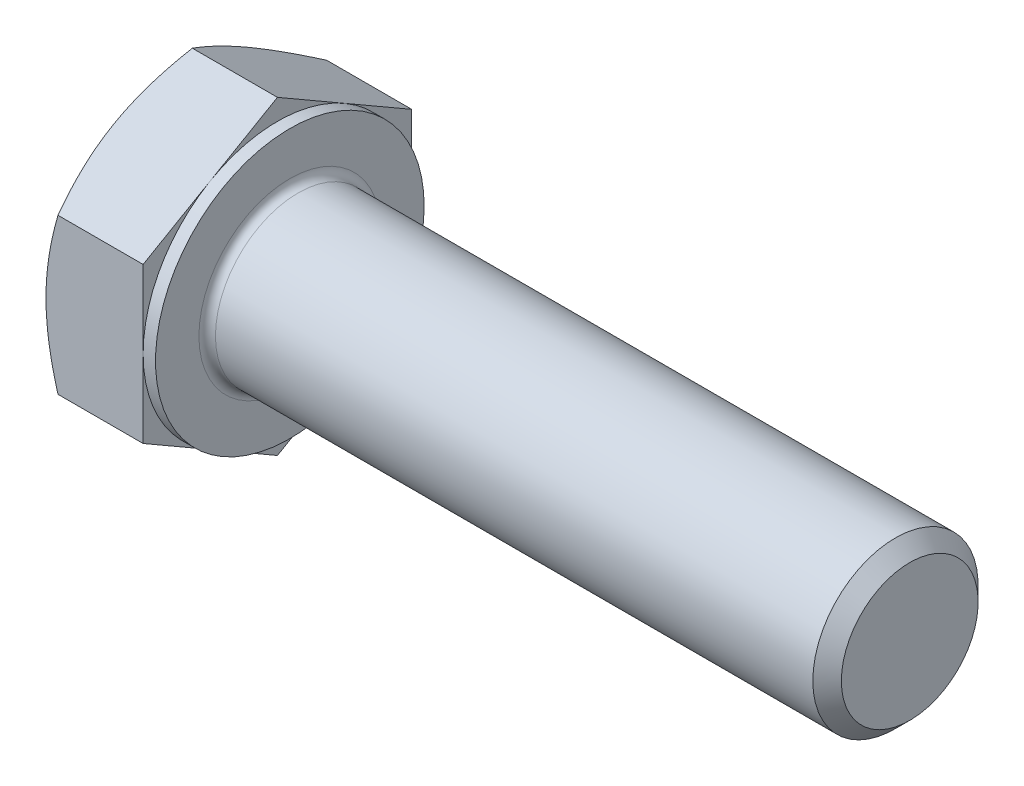
ISO-10303-21;
HEADER;
FILE_DESCRIPTION(('STEP AP214'),'2;1');
FILE_NAME('part.step','',(''),(''),'','','');
FILE_SCHEMA(('AUTOMOTIVE_DESIGN { 1 0 10303 214 1 1 1 1 }'));
ENDSEC;
DATA;
#1=APPLICATION_CONTEXT('core data for automotive mechanical design processes');
#2=APPLICATION_PROTOCOL_DEFINITION('international standard','automotive_design',2000,#1);
#3=PRODUCT_CONTEXT('',#1,'mechanical');
#4=PRODUCT('Part','Part','',(#3));
#5=PRODUCT_RELATED_PRODUCT_CATEGORY('part','',(#4));
#6=PRODUCT_DEFINITION_FORMATION('','',#4);
#7=PRODUCT_DEFINITION_CONTEXT('part definition',#1,'design');
#8=PRODUCT_DEFINITION('design','',#6,#7);
#9=PRODUCT_DEFINITION_SHAPE('','',#8);
#10=(LENGTH_UNIT() NAMED_UNIT(*) SI_UNIT(.MILLI.,.METRE.));
#11=(NAMED_UNIT(*) PLANE_ANGLE_UNIT() SI_UNIT($,.RADIAN.));
#12=(NAMED_UNIT(*) SI_UNIT($,.STERADIAN.) SOLID_ANGLE_UNIT());
#13=UNCERTAINTY_MEASURE_WITH_UNIT(LENGTH_MEASURE(1.E-05),#10,'distance_accuracy_value','');
#14=(GEOMETRIC_REPRESENTATION_CONTEXT(3) GLOBAL_UNCERTAINTY_ASSIGNED_CONTEXT((#13)) GLOBAL_UNIT_ASSIGNED_CONTEXT((#10,
#11,#12)) REPRESENTATION_CONTEXT('',''));
#15=CARTESIAN_POINT('',(0.,0.,0.));
#16=DIRECTION('',(0.,0.,1.));
#17=DIRECTION('',(1.,0.,0.));
#18=AXIS2_PLACEMENT_3D('',#15,#16,#17);
#19=CARTESIAN_POINT('',(5.3,7.50555349946514,0.));
#20=DIRECTION('',(1.,0.,0.));
#21=DIRECTION('',(0.,0.,-1.));
#22=AXIS2_PLACEMENT_3D('',#19,#20,#21);
#23=PLANE('',#22);
#24=CARTESIAN_POINT('',(5.3,0.,0.));
#25=DIRECTION('',(1.,0.,0.));
#26=DIRECTION('',(0.,0.,-1.));
#27=AXIS2_PLACEMENT_3D('',#24,#25,#26);
#28=CIRCLE('',#27,4.4);
#29=CARTESIAN_POINT('',(5.3,0.,-4.4));
#30=VERTEX_POINT('',#29);
#31=EDGE_CURVE('E45',#30,#30,#28,.F.);
#32=ORIENTED_EDGE('',*,*,#31,.T.);
#33=EDGE_LOOP('',(#32));
#34=FACE_BOUND('',#33,.T.);
#35=CARTESIAN_POINT('',(5.3,0.,0.));
#36=DIRECTION('',(1.,0.,0.));
#37=DIRECTION('',(0.,0.,-1.));
#38=AXIS2_PLACEMENT_3D('',#35,#36,#37);
#39=CIRCLE('',#38,6.5);
#40=CARTESIAN_POINT('',(5.3,0.,-6.5));
#41=VERTEX_POINT('',#40);
#42=EDGE_CURVE('E296',#41,#41,#39,.T.);
#43=ORIENTED_EDGE('',*,*,#42,.T.);
#44=EDGE_LOOP('',(#43));
#45=FACE_BOUND('',#44,.T.);
#46=ADVANCED_FACE('F37',(#34,#45),#23,.T.);
#47=CARTESIAN_POINT('',(0.,0.,0.));
#48=DIRECTION('',(-1.,0.,0.));
#49=DIRECTION('',(0.,0.,1.));
#50=AXIS2_PLACEMENT_3D('',#47,#48,#49);
#51=CYLINDRICAL_SURFACE('',#50,4.);
#52=CARTESIAN_POINT('',(5.7,0.,0.));
#53=DIRECTION('',(1.,0.,0.));
#54=DIRECTION('',(0.,0.,-1.));
#55=AXIS2_PLACEMENT_3D('',#52,#53,#54);
#56=CIRCLE('',#55,4.);
#57=CARTESIAN_POINT('',(5.7,0.,-4.));
#58=VERTEX_POINT('',#57);
#59=EDGE_CURVE('E11',#58,#58,#56,.T.);
#60=ORIENTED_EDGE('',*,*,#59,.T.);
#61=EDGE_LOOP('',(#60));
#62=FACE_BOUND('',#61,.T.);
#63=CARTESIAN_POINT('',(34.6095000000001,0.,0.));
#64=DIRECTION('',(-1.,0.,0.));
#65=DIRECTION('',(0.,0.,1.));
#66=AXIS2_PLACEMENT_3D('',#63,#64,#65);
#67=CIRCLE('',#66,4.);
#68=CARTESIAN_POINT('',(34.6095000000001,0.,4.));
#69=VERTEX_POINT('',#68);
#70=EDGE_CURVE('E275',#69,#69,#67,.T.);
#71=ORIENTED_EDGE('',*,*,#70,.T.);
#72=EDGE_LOOP('',(#71));
#73=FACE_BOUND('',#72,.T.);
#74=ADVANCED_FACE('F249',(#62,#73),#51,.T.);
#75=CARTESIAN_POINT('',(35.3,0.,0.));
#76=DIRECTION('',(-1.,0.,0.));
#77=DIRECTION('',(0.,0.,1.));
#78=AXIS2_PLACEMENT_3D('',#75,#76,#77);
#79=CONICAL_SURFACE('',#78,3.3095,0.785398163397499);
#80=ORIENTED_EDGE('',*,*,#70,.F.);
#81=EDGE_LOOP('',(#80));
#82=FACE_BOUND('',#81,.T.);
#83=CARTESIAN_POINT('',(35.3,0.,0.));
#84=DIRECTION('',(-1.,0.,0.));
#85=DIRECTION('',(0.,0.,1.));
#86=AXIS2_PLACEMENT_3D('',#83,#84,#85);
#87=CIRCLE('',#86,3.3095);
#88=CARTESIAN_POINT('',(35.3,0.,3.3095));
#89=VERTEX_POINT('',#88);
#90=EDGE_CURVE('E273',#89,#89,#87,.T.);
#91=ORIENTED_EDGE('',*,*,#90,.T.);
#92=EDGE_LOOP('',(#91));
#93=FACE_BOUND('',#92,.T.);
#94=ADVANCED_FACE('F254',(#82,#93),#79,.T.);
#95=CARTESIAN_POINT('',(35.3,0.,0.));
#96=DIRECTION('',(-1.,0.,0.));
#97=DIRECTION('',(0.,0.,1.));
#98=AXIS2_PLACEMENT_3D('',#95,#96,#97);
#99=PLANE('',#98);
#100=ORIENTED_EDGE('',*,*,#90,.F.);
#101=EDGE_LOOP('',(#100));
#102=FACE_BOUND('',#101,.T.);
#103=ADVANCED_FACE('F261',(#102),#99,.F.);
#104=CARTESIAN_POINT('',(4.7,6.5,0.));
#105=DIRECTION('',(1.,0.,0.));
#106=DIRECTION('',(0.,0.,-1.));
#107=AXIS2_PLACEMENT_3D('',#104,#105,#106);
#108=PLANE('',#107);
#109=DIRECTION('',(0.,0.500000000000001,0.866025403784438));
#110=VECTOR('',#109,1.);
#111=CARTESIAN_POINT('',(4.7,3.75277674973256,-6.5));
#112=LINE('',#111,#110);
#113=CARTESIAN_POINT('',(4.7,3.75277674973256,-6.5));
#114=VERTEX_POINT('',#113);
#115=CARTESIAN_POINT('',(4.7,5.62916512459885,-3.25));
#116=VERTEX_POINT('',#115);
#117=EDGE_CURVE('E169',#114,#116,#112,.T.);
#118=ORIENTED_EDGE('',*,*,#117,.T.);
#119=CARTESIAN_POINT('',(4.7,0.,0.));
#120=DIRECTION('',(-1.,0.,0.));
#121=DIRECTION('',(0.,0.,1.));
#122=AXIS2_PLACEMENT_3D('',#119,#120,#121);
#123=CIRCLE('',#122,6.5);
#124=CARTESIAN_POINT('',(4.7,0.,-6.5));
#125=VERTEX_POINT('',#124);
#126=EDGE_CURVE('E52',#116,#125,#123,.T.);
#127=ORIENTED_EDGE('',*,*,#126,.T.);
#128=DIRECTION('',(0.,1.,0.));
#129=VECTOR('',#128,1.);
#130=CARTESIAN_POINT('',(4.7,3.75277674973256,-6.5));
#131=LINE('',#130,#129);
#132=EDGE_CURVE('E299',#125,#114,#131,.T.);
#133=ORIENTED_EDGE('',*,*,#132,.T.);
#134=EDGE_LOOP('',(#118,#127,#133));
#135=FACE_BOUND('',#134,.T.);
#136=ADVANCED_FACE('F264',(#135),#108,.T.);
#137=CARTESIAN_POINT('',(4.7,7.50555349946514,0.));
#138=VERTEX_POINT('',#137);
#139=EDGE_CURVE('E167',#116,#138,#112,.T.);
#140=ORIENTED_EDGE('',*,*,#139,.T.);
#141=DIRECTION('',(0.,-0.500000000000001,0.866025403784438));
#142=VECTOR('',#141,1.);
#143=CARTESIAN_POINT('',(4.7,7.50555349946514,0.));
#144=LINE('',#143,#142);
#145=CARTESIAN_POINT('',(4.7,5.62916512459885,3.25));
#146=VERTEX_POINT('',#145);
#147=EDGE_CURVE('E166',#138,#146,#144,.T.);
#148=ORIENTED_EDGE('',*,*,#147,.T.);
#149=EDGE_CURVE('E155',#146,#116,#123,.T.);
#150=ORIENTED_EDGE('',*,*,#149,.T.);
#151=EDGE_LOOP('',(#140,#148,#150));
#152=FACE_BOUND('',#151,.T.);
#153=ADVANCED_FACE('F269',(#152),#108,.T.);
#154=CARTESIAN_POINT('',(4.7,3.75277674973257,6.5));
#155=VERTEX_POINT('',#154);
#156=EDGE_CURVE('E134',#146,#155,#144,.T.);
#157=ORIENTED_EDGE('',*,*,#156,.T.);
#158=DIRECTION('',(0.,-1.,0.));
#159=VECTOR('',#158,1.);
#160=CARTESIAN_POINT('',(4.7,3.75277674973257,6.5));
#161=LINE('',#160,#159);
#162=CARTESIAN_POINT('',(4.7,0.,6.5));
#163=VERTEX_POINT('',#162);
#164=EDGE_CURVE('E128',#155,#163,#161,.T.);
#165=ORIENTED_EDGE('',*,*,#164,.T.);
#166=EDGE_CURVE('E132',#163,#146,#123,.T.);
#167=ORIENTED_EDGE('',*,*,#166,.T.);
#168=EDGE_LOOP('',(#157,#165,#167));
#169=FACE_BOUND('',#168,.T.);
#170=ADVANCED_FACE('F130',(#169),#108,.T.);
#171=CARTESIAN_POINT('',(4.7,-3.75277674973257,6.5));
#172=VERTEX_POINT('',#171);
#173=EDGE_CURVE('E138',#163,#172,#161,.T.);
#174=ORIENTED_EDGE('',*,*,#173,.T.);
#175=DIRECTION('',(0.,-0.500000000000001,-0.866025403784438));
#176=VECTOR('',#175,1.);
#177=CARTESIAN_POINT('',(4.7,-7.50555349946515,0.));
#178=LINE('',#177,#176);
#179=CARTESIAN_POINT('',(4.7,-5.62916512459885,3.25000000000001));
#180=VERTEX_POINT('',#179);
#181=EDGE_CURVE('E145',#172,#180,#178,.T.);
#182=ORIENTED_EDGE('',*,*,#181,.T.);
#183=EDGE_CURVE('E142',#180,#163,#123,.T.);
#184=ORIENTED_EDGE('',*,*,#183,.T.);
#185=EDGE_LOOP('',(#174,#182,#184));
#186=FACE_BOUND('',#185,.T.);
#187=ADVANCED_FACE('F143',(#186),#108,.T.);
#188=CARTESIAN_POINT('',(4.7,-7.50555349946515,0.));
#189=VERTEX_POINT('',#188);
#190=EDGE_CURVE('E161',#180,#189,#178,.T.);
#191=ORIENTED_EDGE('',*,*,#190,.T.);
#192=DIRECTION('',(0.,0.5,-0.866025403784438));
#193=VECTOR('',#192,1.);
#194=CARTESIAN_POINT('',(4.7,-3.75277674973257,-6.5));
#195=LINE('',#194,#193);
#196=CARTESIAN_POINT('',(4.7,-5.62916512459885,-3.25));
#197=VERTEX_POINT('',#196);
#198=EDGE_CURVE('E337',#189,#197,#195,.T.);
#199=ORIENTED_EDGE('',*,*,#198,.T.);
#200=EDGE_CURVE('E149',#197,#180,#123,.T.);
#201=ORIENTED_EDGE('',*,*,#200,.T.);
#202=EDGE_LOOP('',(#191,#199,#201));
#203=FACE_BOUND('',#202,.T.);
#204=ADVANCED_FACE('F338',(#203),#108,.T.);
#205=CARTESIAN_POINT('',(4.7,-3.75277674973257,-6.5));
#206=VERTEX_POINT('',#205);
#207=EDGE_CURVE('E156',#197,#206,#195,.T.);
#208=ORIENTED_EDGE('',*,*,#207,.T.);
#209=EDGE_CURVE('E300',#206,#125,#131,.T.);
#210=ORIENTED_EDGE('',*,*,#209,.T.);
#211=EDGE_CURVE('E307',#125,#197,#123,.T.);
#212=ORIENTED_EDGE('',*,*,#211,.T.);
#213=EDGE_LOOP('',(#208,#210,#212));
#214=FACE_BOUND('',#213,.T.);
#215=ADVANCED_FACE('F270',(#214),#108,.T.);
#216=CARTESIAN_POINT('',(0.,0.,0.));
#217=DIRECTION('',(-1.,0.,0.));
#218=DIRECTION('',(0.,0.,1.));
#219=AXIS2_PLACEMENT_3D('',#216,#217,#218);
#220=CYLINDRICAL_SURFACE('',#219,6.5);
#221=ORIENTED_EDGE('',*,*,#126,.F.);
#222=ORIENTED_EDGE('',*,*,#149,.F.);
#223=ORIENTED_EDGE('',*,*,#166,.F.);
#224=ORIENTED_EDGE('',*,*,#183,.F.);
#225=ORIENTED_EDGE('',*,*,#200,.F.);
#226=ORIENTED_EDGE('',*,*,#211,.F.);
#227=EDGE_LOOP('',(#221,#222,#223,#224,#225,#226));
#228=FACE_BOUND('',#227,.T.);
#229=ORIENTED_EDGE('',*,*,#42,.F.);
#230=EDGE_LOOP('',(#229));
#231=FACE_BOUND('',#230,.T.);
#232=ADVANCED_FACE('F152',(#228,#231),#220,.T.);
#233=CARTESIAN_POINT('',(0.,7.50555349946514,0.));
#234=DIRECTION('',(1.,0.,0.));
#235=DIRECTION('',(0.,0.,-1.));
#236=AXIS2_PLACEMENT_3D('',#233,#234,#235);
#237=PLANE('',#236);
#238=CARTESIAN_POINT('',(0.,0.,0.));
#239=DIRECTION('',(1.,0.,0.));
#240=DIRECTION('',(0.,0.,-1.));
#241=AXIS2_PLACEMENT_3D('',#238,#239,#240);
#242=CIRCLE('',#241,6.5);
#243=CARTESIAN_POINT('',(0.,0.,-6.5));
#244=VERTEX_POINT('',#243);
#245=CARTESIAN_POINT('',(0.,5.62916512459885,-3.25000000000001));
#246=VERTEX_POINT('',#245);
#247=EDGE_CURVE('E295',#244,#246,#242,.T.);
#248=ORIENTED_EDGE('',*,*,#247,.F.);
#249=CARTESIAN_POINT('',(0.,-5.62916512459885,-3.25));
#250=VERTEX_POINT('',#249);
#251=EDGE_CURVE('E291',#250,#244,#242,.T.);
#252=ORIENTED_EDGE('',*,*,#251,.F.);
#253=CARTESIAN_POINT('',(0.,-5.62916512459885,3.25000000000001));
#254=VERTEX_POINT('',#253);
#255=EDGE_CURVE('E294',#254,#250,#242,.T.);
#256=ORIENTED_EDGE('',*,*,#255,.F.);
#257=CARTESIAN_POINT('',(0.,0.,6.5));
#258=VERTEX_POINT('',#257);
#259=EDGE_CURVE('E330',#258,#254,#242,.T.);
#260=ORIENTED_EDGE('',*,*,#259,.F.);
#261=CARTESIAN_POINT('',(0.,0.,0.));
#262=DIRECTION('',(-1.,0.,0.));
#263=DIRECTION('',(0.,0.,1.));
#264=AXIS2_PLACEMENT_3D('',#261,#262,#263);
#265=CIRCLE('',#264,6.5);
#266=CARTESIAN_POINT('',(0.,5.62916512459885,3.25));
#267=VERTEX_POINT('',#266);
#268=EDGE_CURVE('E170',#258,#267,#265,.T.);
#269=ORIENTED_EDGE('',*,*,#268,.T.);
#270=EDGE_CURVE('E353',#246,#267,#242,.T.);
#271=ORIENTED_EDGE('',*,*,#270,.F.);
#272=EDGE_LOOP('',(#248,#252,#256,#260,#269,#271));
#273=FACE_BOUND('',#272,.T.);
#274=ADVANCED_FACE('F199',(#273),#237,.F.);
#275=CARTESIAN_POINT('',(0.,0.,0.));
#276=DIRECTION('',(1.,0.,0.));
#277=DIRECTION('',(0.,0.,-1.));
#278=AXIS2_PLACEMENT_3D('',#275,#276,#277);
#279=CONICAL_SURFACE('',#278,6.5,1.0471975511966);
#280=CARTESIAN_POINT('',(0.580623251805866,3.75266127967873,6.5002));
#281=CARTESIAN_POINT('',(0.533004423075484,3.8351516191275,6.35732254094112));
#282=CARTESIAN_POINT('',(0.487546700602705,3.91794952254312,6.21391236546509));
#283=CARTESIAN_POINT('',(0.401548682023045,4.08421773795794,5.9259273686828));
#284=CARTESIAN_POINT('',(0.361010507228025,4.16768832359105,5.78135207342874));
#285=CARTESIAN_POINT('',(0.247571001123208,4.41943655294051,5.34531134947997));
#286=CARTESIAN_POINT('',(0.183047807128739,4.58870793403689,5.05212471715368));
#287=CARTESIAN_POINT('',(0.107386583547491,4.84201947708215,4.61337625445563));
#288=CARTESIAN_POINT('',(0.0858328564569876,4.92530276780316,4.46912536350531));
#289=CARTESIAN_POINT('',(0.0496903146061193,5.09224566542477,4.17997178286191));
#290=CARTESIAN_POINT('',(0.0351008844596668,5.17590523841627,4.03506915190111));
#291=CARTESIAN_POINT('',(0.0132587525073474,5.34336968579964,3.74501222057168));
#292=CARTESIAN_POINT('',(0.00599772432210874,5.427174286676,3.59985839394579));
#293=CARTESIAN_POINT('',(-0.00103969741776747,5.59485627940483,3.30942466302505));
#294=CARTESIAN_POINT('',(-0.000816322187794363,5.6787336689286,3.16414476276364));
#295=CARTESIAN_POINT('',(0.0100834585151661,5.90853103021317,2.76612405757351));
#296=CARTESIAN_POINT('',(0.0283818178694145,6.05437578112763,2.51351353897243));
#297=CARTESIAN_POINT('',(0.0864063414576765,6.34509659313135,2.00997032176432));
#298=CARTESIAN_POINT('',(0.126152338538246,6.48997163178545,1.75903939406692));
#299=CARTESIAN_POINT('',(0.225505903202151,6.78127752911039,1.25448277935568));
#300=CARTESIAN_POINT('',(0.285534425638029,6.92767163007068,1.00092075856409));
#301=CARTESIAN_POINT('',(0.421774992509871,7.21827667013277,0.497578064240955));
#302=CARTESIAN_POINT('',(0.497955034163596,7.36249133098589,0.247790944447036));
#303=CARTESIAN_POINT('',(0.58062325180587,7.50566896951898,-0.000199999999999748));
#304=B_SPLINE_CURVE_WITH_KNOTS('',3,(#280,#281,#282,#283,#284,#285,#286,#287,#288,#289,#290,
#291,#292,#293,#294,#295,#296,#297,#298,#299,#300,#301,#302,#303),.UNSPECIFIED.,.F.,.F.,(4,2,2,
2,2,2,2,2,2,2,2,4),(0.,0.515105052395587,1.03043143507524,2.06322554824262,2.56697389547996,
3.07067772176453,3.57380860368928,4.0769239424252,4.9527935470566,5.82947446853466,
6.72559912449737,7.61996451221046),.UNSPECIFIED.);
#305=CARTESIAN_POINT('',(0.580556583600765,7.50555349946514,0.));
#306=VERTEX_POINT('',#305);
#307=EDGE_CURVE('E218',#267,#306,#304,.T.);
#308=ORIENTED_EDGE('',*,*,#307,.T.);
#309=CARTESIAN_POINT('',(0.580623251805869,7.50566896951898,0.000199999999999942));
#310=CARTESIAN_POINT('',(0.533004423075488,7.4231786300702,-0.14267745905888));
#311=CARTESIAN_POINT('',(0.487546700602708,7.34038072665458,-0.286087634534913));
#312=CARTESIAN_POINT('',(0.401548682023048,7.17411251123976,-0.574072631317195));
#313=CARTESIAN_POINT('',(0.361010507228027,7.09064192560665,-0.718647926571264));
#314=CARTESIAN_POINT('',(0.24757100112321,6.83889369625719,-1.15468865052003));
#315=CARTESIAN_POINT('',(0.183047807128741,6.66962231516081,-1.44787528284632));
#316=CARTESIAN_POINT('',(0.107386583547493,6.41631077211555,-1.88662374554437));
#317=CARTESIAN_POINT('',(0.0858328564569886,6.33302748139454,-2.03087463649469));
#318=CARTESIAN_POINT('',(0.0496903146061198,6.16608458377293,-2.32002821713809));
#319=CARTESIAN_POINT('',(0.0351008844596674,6.08242501078143,-2.46493084809889));
#320=CARTESIAN_POINT('',(0.0132587525073476,5.91496056339806,-2.75498777942832));
#321=CARTESIAN_POINT('',(0.00599772432210844,5.8311559625217,-2.90014160605421));
#322=CARTESIAN_POINT('',(-0.00103969741776819,5.66347396979287,-3.19057533697495));
#323=CARTESIAN_POINT('',(-0.000816322187794986,5.5795965802691,-3.33585523723636));
#324=CARTESIAN_POINT('',(0.0100834585151655,5.34979921898453,-3.73387594242649));
#325=CARTESIAN_POINT('',(0.0283818178694135,5.20395446807007,-3.98648646102757));
#326=CARTESIAN_POINT('',(0.0864063414576748,4.91323365606635,-4.49002967823568));
#327=CARTESIAN_POINT('',(0.126152338538244,4.76835861741226,-4.74096060593308));
#328=CARTESIAN_POINT('',(0.225505903202148,4.47705272008731,-5.24551722064432));
#329=CARTESIAN_POINT('',(0.285534425638025,4.33065861912702,-5.49907924143591));
#330=CARTESIAN_POINT('',(0.421774992509867,4.04005357906493,-6.00242193575904));
#331=CARTESIAN_POINT('',(0.497955034163591,3.89583891821181,-6.25220905555296));
#332=CARTESIAN_POINT('',(0.580623251805865,3.75266127967873,-6.5002));
#333=B_SPLINE_CURVE_WITH_KNOTS('',3,(#309,#310,#311,#312,#313,#314,#315,#316,#317,#318,#319,
#320,#321,#322,#323,#324,#325,#326,#327,#328,#329,#330,#331,#332),.UNSPECIFIED.,.F.,.F.,(4,2,2,
2,2,2,2,2,2,2,2,4),(0.,0.515105052395588,1.03043143507525,2.06322554824262,2.56697389547996,
3.07067772176454,3.57380860368928,4.0769239424252,4.9527935470566,5.82947446853466,
6.72559912449737,7.61996451221046),.UNSPECIFIED.);
#334=EDGE_CURVE('E60',#306,#246,#333,.T.);
#335=ORIENTED_EDGE('',*,*,#334,.T.);
#336=ORIENTED_EDGE('',*,*,#270,.T.);
#337=EDGE_LOOP('',(#308,#335,#336));
#338=FACE_BOUND('',#337,.T.);
#339=ADVANCED_FACE('F354',(#338),#279,.T.);
#340=CARTESIAN_POINT('',(3.18835311563219,-10.1137456673369,6.5));
#341=CARTESIAN_POINT('',(3.05034773984572,-9.82952666268363,6.5));
#342=CARTESIAN_POINT('',(2.91365616465171,-9.54465869597371,6.5));
#343=CARTESIAN_POINT('',(2.64363899475029,-8.9732797800977,6.5));
#344=CARTESIAN_POINT('',(2.51031392437709,-8.68676858342199,6.5));
#345=CARTESIAN_POINT('',(2.24710473463581,-8.11029837800202,6.5));
#346=CARTESIAN_POINT('',(2.11724300420667,-7.82032911160932,6.5));
#347=CARTESIAN_POINT('',(1.86279082811121,-7.23809540985589,6.5));
#348=CARTESIAN_POINT('',(1.73820013539999,-6.94583108282378,6.5));
#349=CARTESIAN_POINT('',(1.49176685414526,-6.34906440932191,6.5));
#350=CARTESIAN_POINT('',(1.37014257629962,-6.04447142260091,6.5));
#351=CARTESIAN_POINT('',(1.13601865749049,-5.43173420932697,6.5));
#352=CARTESIAN_POINT('',(1.02352003549993,-5.12358959057326,6.5));
#353=CARTESIAN_POINT('',(0.810575368180004,-4.50382569763975,6.5));
#354=CARTESIAN_POINT('',(0.710105232251767,-4.19221478250845,6.5));
#355=CARTESIAN_POINT('',(0.524420166111968,-3.56452019194197,6.5));
#356=CARTESIAN_POINT('',(0.43920046818201,-3.24843794783301,6.5));
#357=CARTESIAN_POINT('',(0.28852422339307,-2.61335465708694,6.5));
#358=CARTESIAN_POINT('',(0.222961865744182,-2.29437912058767,6.5));
#359=CARTESIAN_POINT('',(0.115312883140194,-1.65238219411908,6.5));
#360=CARTESIAN_POINT('',(0.0732239014810098,-1.32936121363907,6.5));
#361=CARTESIAN_POINT('',(0.0304887136492795,-0.845231171985981,6.5));
#362=CARTESIAN_POINT('',(0.0196493434374819,-0.684982209825928,6.5));
#363=CARTESIAN_POINT('',(0.00475298486802846,-0.36416234926191,6.5));
#364=CARTESIAN_POINT('',(0.000695882912926895,-0.203591456295123,6.5));
#365=CARTESIAN_POINT('',(-0.000531597192431546,0.117577430127594,6.5));
#366=CARTESIAN_POINT('',(0.0022980901638525,0.278175423826775,6.5));
#367=CARTESIAN_POINT('',(0.0147726845392769,0.599108972527028,6.5));
#368=CARTESIAN_POINT('',(0.02441792602929,0.759444514261296,6.5));
#369=CARTESIAN_POINT('',(0.0554961939005604,1.1436994656868,6.5));
#370=CARTESIAN_POINT('',(0.0801030490102257,1.36736763010323,6.5));
#371=CARTESIAN_POINT('',(0.141246537396775,1.81305591275147,6.5));
#372=CARTESIAN_POINT('',(0.177784759549959,2.03507580745699,6.5));
#373=CARTESIAN_POINT('',(0.303360001243782,2.69839633393826,6.5));
#374=CARTESIAN_POINT('',(0.408335815043152,3.13672010332746,6.5));
#375=CARTESIAN_POINT('',(0.590564593006711,3.79232112874051,6.5));
#376=CARTESIAN_POINT('',(0.656313198842876,4.0129915082917,6.5));
#377=CARTESIAN_POINT('',(0.794681634048783,4.45218858961826,6.5));
#378=CARTESIAN_POINT('',(0.86730151296292,4.67071527592427,6.5));
#379=CARTESIAN_POINT('',(1.01824353836802,5.10569490203687,6.5));
#380=CARTESIAN_POINT('',(1.09656388214599,5.32214847315216,6.5));
#381=CARTESIAN_POINT('',(1.2579808614511,5.75325725721538,6.5));
#382=CARTESIAN_POINT('',(1.34107741015562,5.96791250277234,6.5));
#383=CARTESIAN_POINT('',(1.56029019561415,6.51888445883541,6.5));
#384=CARTESIAN_POINT('',(1.69936356644503,6.85402316761087,6.5));
#385=CARTESIAN_POINT('',(1.98501958064621,7.521095838874,6.5));
#386=CARTESIAN_POINT('',(2.13160288757765,7.85302951508195,6.5));
#387=CARTESIAN_POINT('',(2.43059748021416,8.51437865467403,6.5));
#388=CARTESIAN_POINT('',(2.5830105757321,8.84379329733068,6.5));
#389=CARTESIAN_POINT('',(2.89234869350808,9.50047798633191,6.5));
#390=CARTESIAN_POINT('',(3.04927357195785,9.82774810062368,6.5));
#391=CARTESIAN_POINT('',(3.36692013106101,10.4809971970749,6.5));
#392=CARTESIAN_POINT('',(3.52764676467091,10.8069737662429,6.5));
#393=CARTESIAN_POINT('',(3.85198555530079,11.4574882896092,6.5));
#394=CARTESIAN_POINT('',(4.01559773098172,11.7820262344869,6.5));
#395=CARTESIAN_POINT('',(4.50986184978697,12.753746810957,6.5));
#396=CARTESIAN_POINT('',(4.84399997953393,13.399155592763,6.5));
#397=CARTESIAN_POINT('',(5.48575990240557,14.6239779286089,6.5));
#398=CARTESIAN_POINT('',(5.79279643346765,15.20369957558,6.5));
#399=CARTESIAN_POINT('',(6.41069188201846,16.361138263307,6.5));
#400=CARTESIAN_POINT('',(6.72155098984205,16.9388552023925,6.5));
#401=CARTESIAN_POINT('',(7.34519775412869,18.0910273551188,6.5));
#402=CARTESIAN_POINT('',(7.65797694142596,18.6654871601313,6.5));
#403=CARTESIAN_POINT('',(8.28574397126581,19.8131486199609,6.5));
#404=CARTESIAN_POINT('',(8.60073166267674,20.386350357412,6.5));
#405=CARTESIAN_POINT('',(8.91652967142033,20.9591024516605,6.5));
#406=B_SPLINE_CURVE_WITH_KNOTS('',3,(#340,#341,#342,#343,#344,#345,#346,#347,#348,#349,#350,
#351,#352,#353,#354,#355,#356,#357,#358,#359,#360,#361,#362,#363,#364,#365,#366,#367,#368,#369,
#370,#371,#372,#373,#374,#375,#376,#377,#378,#379,#380,#381,#382,#383,#384,#385,#386,#387,#388,
#389,#390,#391,#392,#393,#394,#395,#396,#397,#398,#399,#400,#401,#402,#403,#404,#405),
.UNSPECIFIED.,.F.,.F.,(4,2,2,2,2,2,2,2,2,2,2,2,2,2,2,2,2,2,2,2,2,2,2,2,2,2,2,2,2,2,2,2,4),(0.,
0.947868666637,1.89588406470429,2.84900320910869,3.80207763278045,4.78589774049431,
5.7698275510146,6.75175256199404,7.7333700571013,8.70960474826445,9.6857414087631,
10.1674651045585,10.6491807317952,11.1309009410869,11.612644792267,12.2873175714037,
12.9620802320305,14.3123184370259,15.0030310333297,15.6937486103038,16.3842486961975,
17.074736234034,18.1631508671877,19.2516618366358,20.3405135130782,21.4293305219254,
22.5196540535909,23.6099846390268,25.7902468223404,27.7582608860787,29.7263733417655,
31.6886408583916,33.6507753794603),.UNSPECIFIED.);
#407=CARTESIAN_POINT('',(0.580556583600761,3.75277674973256,6.5));
#408=VERTEX_POINT('',#407);
#409=EDGE_CURVE('E230',#258,#408,#406,.T.);
#410=ORIENTED_EDGE('',*,*,#409,.T.);
#411=EDGE_CURVE('E229',#408,#267,#304,.T.);
#412=ORIENTED_EDGE('',*,*,#411,.T.);
#413=ORIENTED_EDGE('',*,*,#268,.F.);
#414=EDGE_LOOP('',(#410,#412,#413));
#415=FACE_BOUND('',#414,.T.);
#416=ADVANCED_FACE('F324',(#415),#279,.T.);
#417=CARTESIAN_POINT('',(0.580556583600763,-3.75277674973257,6.5));
#418=VERTEX_POINT('',#417);
#419=EDGE_CURVE('E276',#418,#258,#406,.T.);
#420=ORIENTED_EDGE('',*,*,#419,.T.);
#421=ORIENTED_EDGE('',*,*,#259,.T.);
#422=CARTESIAN_POINT('',(0.580623251805874,-7.50566896951898,-0.000199999999999312));
#423=CARTESIAN_POINT('',(0.533004423075492,-7.42317863007021,0.142677459058881));
#424=CARTESIAN_POINT('',(0.487546700602712,-7.34038072665459,0.286087634534913));
#425=CARTESIAN_POINT('',(0.401548682023052,-7.17411251123977,0.574072631317195));
#426=CARTESIAN_POINT('',(0.361010507228031,-7.09064192560666,0.718647926571265));
#427=CARTESIAN_POINT('',(0.247571001123215,-6.8388936962572,1.15468865052003));
#428=CARTESIAN_POINT('',(0.183047807128745,-6.66962231516082,1.44787528284632));
#429=CARTESIAN_POINT('',(0.107386583547497,-6.41631077211556,1.88662374554438));
#430=CARTESIAN_POINT('',(0.0858328564569923,-6.33302748139455,2.03087463649469));
#431=CARTESIAN_POINT('',(0.0496903146061237,-6.16608458377294,2.32002821713809));
#432=CARTESIAN_POINT('',(0.0351008844596715,-6.08242501078144,2.46493084809889));
#433=CARTESIAN_POINT('',(0.0132587525073515,-5.91496056339807,2.75498777942832));
#434=CARTESIAN_POINT('',(0.00599772432211225,-5.83115596252171,2.90014160605421));
#435=CARTESIAN_POINT('',(-0.00103969741776448,-5.66347396979287,3.19057533697495));
#436=CARTESIAN_POINT('',(-0.000816322187791216,-5.57959658026911,3.33585523723636));
#437=CARTESIAN_POINT('',(0.0100834585151692,-5.34979921898454,3.7338759424265));
#438=CARTESIAN_POINT('',(0.0283818178694169,-5.20395446807007,3.98648646102757));
#439=CARTESIAN_POINT('',(0.0864063414576783,-4.91323365606636,4.49002967823568));
#440=CARTESIAN_POINT('',(0.126152338538248,-4.76835861741226,4.74096060593308));
#441=CARTESIAN_POINT('',(0.225505903202152,-4.47705272008732,5.24551722064432));
#442=CARTESIAN_POINT('',(0.285534425638028,-4.33065861912703,5.49907924143591));
#443=CARTESIAN_POINT('',(0.421774992509869,-4.04005357906494,6.00242193575904));
#444=CARTESIAN_POINT('',(0.497955034163593,-3.89583891821182,6.25220905555296));
#445=CARTESIAN_POINT('',(0.580623251805867,-3.75266127967873,6.5002));
#446=B_SPLINE_CURVE_WITH_KNOTS('',3,(#422,#423,#424,#425,#426,#427,#428,#429,#430,#431,#432,
#433,#434,#435,#436,#437,#438,#439,#440,#441,#442,#443,#444,#445),.UNSPECIFIED.,.F.,.F.,(4,2,2,
2,2,2,2,2,2,2,2,4),(0.,0.515105052395588,1.03043143507525,2.06322554824263,2.56697389547997,
3.07067772176454,3.57380860368928,4.07692394242521,4.95279354705661,5.82947446853467,
6.72559912449737,7.61996451221046),.UNSPECIFIED.);
#447=EDGE_CURVE('E220',#254,#418,#446,.T.);
#448=ORIENTED_EDGE('',*,*,#447,.T.);
#449=EDGE_LOOP('',(#420,#421,#448));
#450=FACE_BOUND('',#449,.T.);
#451=ADVANCED_FACE('F188',(#450),#279,.T.);
#452=CARTESIAN_POINT('',(0.58055658360077,-7.50555349946515,0.));
#453=VERTEX_POINT('',#452);
#454=EDGE_CURVE('E213',#453,#254,#446,.T.);
#455=ORIENTED_EDGE('',*,*,#454,.T.);
#456=ORIENTED_EDGE('',*,*,#255,.T.);
#457=CARTESIAN_POINT('',(0.580623251805869,-3.75266127967874,-6.5002));
#458=CARTESIAN_POINT('',(0.533004423075488,-3.83515161912751,-6.35732254094112));
#459=CARTESIAN_POINT('',(0.487546700602708,-3.91794952254313,-6.21391236546509));
#460=CARTESIAN_POINT('',(0.401548682023048,-4.08421773795795,-5.9259273686828));
#461=CARTESIAN_POINT('',(0.361010507228028,-4.16768832359106,-5.78135207342874));
#462=CARTESIAN_POINT('',(0.247571001123211,-4.41943655294052,-5.34531134947997));
#463=CARTESIAN_POINT('',(0.183047807128742,-4.5887079340369,-5.05212471715368));
#464=CARTESIAN_POINT('',(0.107386583547495,-4.84201947708216,-4.61337625445563));
#465=CARTESIAN_POINT('',(0.0858328564569915,-4.92530276780317,-4.46912536350531));
#466=CARTESIAN_POINT('',(0.0496903146061235,-5.09224566542478,-4.17997178286191));
#467=CARTESIAN_POINT('',(0.0351008844596713,-5.17590523841628,-4.03506915190111));
#468=CARTESIAN_POINT('',(0.0132587525073517,-5.34336968579965,-3.74501222057168));
#469=CARTESIAN_POINT('',(0.00599772432211259,-5.42717428667601,-3.59985839394579));
#470=CARTESIAN_POINT('',(-0.00103969741776356,-5.59485627940485,-3.30942466302505));
#471=CARTESIAN_POINT('',(-0.000816322187789959,-5.67873366892861,-3.16414476276364));
#472=CARTESIAN_POINT('',(0.0100834585151712,-5.90853103021318,-2.7661240575735));
#473=CARTESIAN_POINT('',(0.0283818178694191,-6.05437578112764,-2.51351353897243));
#474=CARTESIAN_POINT('',(0.0864063414576811,-6.34509659313136,-2.00997032176432));
#475=CARTESIAN_POINT('',(0.126152338538251,-6.48997163178545,-1.75903939406691));
#476=CARTESIAN_POINT('',(0.225505903202156,-6.78127752911039,-1.25448277935568));
#477=CARTESIAN_POINT('',(0.285534425638033,-6.92767163007069,-1.00092075856408));
#478=CARTESIAN_POINT('',(0.421774992509875,-7.21827667013278,-0.497578064240954));
#479=CARTESIAN_POINT('',(0.4979550341636,-7.3624913309859,-0.247790944447036));
#480=CARTESIAN_POINT('',(0.580623251805874,-7.50566896951898,0.000200000000001201));
#481=B_SPLINE_CURVE_WITH_KNOTS('',3,(#457,#458,#459,#460,#461,#462,#463,#464,#465,#466,#467,
#468,#469,#470,#471,#472,#473,#474,#475,#476,#477,#478,#479,#480),.UNSPECIFIED.,.F.,.F.,(4,2,2,
2,2,2,2,2,2,2,2,4),(0.,0.515105052395588,1.03043143507525,2.06322554824263,2.56697389547997,
3.07067772176454,3.57380860368928,4.0769239424252,4.95279354705661,5.82947446853467,
6.72559912449737,7.61996451221046),.UNSPECIFIED.);
#482=EDGE_CURVE('E219',#250,#453,#481,.T.);
#483=ORIENTED_EDGE('',*,*,#482,.T.);
#484=EDGE_LOOP('',(#455,#456,#483));
#485=FACE_BOUND('',#484,.T.);
#486=ADVANCED_FACE('F352',(#485),#279,.T.);
#487=CARTESIAN_POINT('',(0.580556583600761,3.75277674973256,-6.5));
#488=VERTEX_POINT('',#487);
#489=EDGE_CURVE('E221',#246,#488,#333,.T.);
#490=ORIENTED_EDGE('',*,*,#489,.T.);
#491=CARTESIAN_POINT('',(3.18835311590246,-10.1137456678934,-6.5));
#492=CARTESIAN_POINT('',(3.05034774010468,-9.82952666322138,-6.5));
#493=CARTESIAN_POINT('',(2.91365616489938,-9.54465869649274,-6.5));
#494=CARTESIAN_POINT('',(2.64363899497542,-8.97327978057922,-6.5));
#495=CARTESIAN_POINT('',(2.51031392459097,-8.68676858388472,-6.5));
#496=CARTESIAN_POINT('',(2.24710473482719,-8.11029837842689,-6.5));
#497=CARTESIAN_POINT('',(2.1172430043868,-7.82032911201512,-6.5));
#498=CARTESIAN_POINT('',(1.86279082826903,-7.2380954102234,-6.5));
#499=CARTESIAN_POINT('',(1.73820013554674,-6.94583108317207,-6.5));
#500=CARTESIAN_POINT('',(1.49176685426961,-6.34906440963036,-6.5));
#501=CARTESIAN_POINT('',(1.37014257641265,-6.04447142288872,-6.5));
#502=CARTESIAN_POINT('',(1.13601865758149,-5.43173420957316,-6.5));
#503=CARTESIAN_POINT('',(1.02352003558022,-5.12358959079846,-6.5));
#504=CARTESIAN_POINT('',(0.810575368239919,-4.5038256978226,-6.5));
#505=CARTESIAN_POINT('',(0.710105232302006,-4.19221478266993,-6.5));
#506=CARTESIAN_POINT('',(0.524420166144454,-3.56452019206012,-6.5));
#507=CARTESIAN_POINT('',(0.439200468206418,-3.24843794792921,-6.5));
#508=CARTESIAN_POINT('',(0.288524223401198,-2.61335465712782,-6.5));
#509=CARTESIAN_POINT('',(0.222961865744749,-2.29437912059505,-6.5));
#510=CARTESIAN_POINT('',(0.115312883130726,-1.65238219405862,-6.5));
#511=CARTESIAN_POINT('',(0.0732239014690643,-1.3293612135443,-6.5));
#512=CARTESIAN_POINT('',(0.030488713638167,-0.845231171839982,-6.5));
#513=CARTESIAN_POINT('',(0.0196493434273846,-0.684982209663099,-6.5));
#514=CARTESIAN_POINT('',(0.00475298486144022,-0.364162349065457,-6.5));
#515=CARTESIAN_POINT('',(0.000695882908832624,-0.203591456081876,-6.5));
#516=CARTESIAN_POINT('',(-0.000531597190094074,0.117577430374299,-6.5));
#517=CARTESIAN_POINT('',(0.00229809017012806,0.278175424090145,-6.5));
#518=CARTESIAN_POINT('',(0.0147726845547652,0.599108972823507,-6.5));
#519=CARTESIAN_POINT('',(0.0244179260500531,0.759444514574219,-6.5));
#520=CARTESIAN_POINT('',(0.0554961939343011,1.14369946602534,-6.5));
#521=CARTESIAN_POINT('',(0.0801030490514524,1.36736763045086,-6.5));
#522=CARTESIAN_POINT('',(0.141246537453378,1.81305591311688,-6.5));
#523=CARTESIAN_POINT('',(0.177784759614453,2.03507580783109,-6.5));
#524=CARTESIAN_POINT('',(0.303360001332117,2.69839633433796,-6.5));
#525=CARTESIAN_POINT('',(0.408335815147596,3.13672010374357,-6.5));
#526=CARTESIAN_POINT('',(0.590564593134941,3.79232112918118,-6.5));
#527=CARTESIAN_POINT('',(0.656313198979092,4.01299150874073,-6.5));
#528=CARTESIAN_POINT('',(0.794681634200733,4.45218859008391,-6.5));
#529=CARTESIAN_POINT('',(0.867301513122619,4.67071527639819,-6.5));
#530=CARTESIAN_POINT('',(1.01824353854295,5.10569490252726,-6.5));
#531=CARTESIAN_POINT('',(1.09656388232839,5.32214847365076,-6.5));
#532=CARTESIAN_POINT('',(1.25798086164821,5.75325725773039,-6.5));
#533=CARTESIAN_POINT('',(1.34107741035995,5.96791250329556,-6.5));
#534=CARTESIAN_POINT('',(1.56029019583041,6.51888445936372,-6.5));
#535=CARTESIAN_POINT('',(1.69936356666534,6.85402316813627,-6.5));
#536=CARTESIAN_POINT('',(1.98501958087353,7.52109583939393,-6.5));
#537=CARTESIAN_POINT('',(2.13160288780791,7.85302951559932,-6.5));
#538=CARTESIAN_POINT('',(2.43059748044951,8.51437865518657,-6.5));
#539=CARTESIAN_POINT('',(2.58301057596959,8.84379329784093,-6.5));
#540=CARTESIAN_POINT('',(2.89234869374926,9.50047798683784,-6.5));
#541=CARTESIAN_POINT('',(3.04927357220058,9.82774810112756,-6.5));
#542=CARTESIAN_POINT('',(3.36692013130636,10.4809971975748,-6.5));
#543=CARTESIAN_POINT('',(3.52764676491733,10.8069737667408,-6.5));
#544=CARTESIAN_POINT('',(3.85198555554899,11.4574882901034,-6.5));
#545=CARTESIAN_POINT('',(4.01559773123065,11.7820262349792,-6.5));
#546=CARTESIAN_POINT('',(4.50986185003773,12.753746811444,-6.5));
#547=CARTESIAN_POINT('',(4.8439999797854,13.3991555932469,-6.5));
#548=CARTESIAN_POINT('',(5.48575990265919,14.6239779290894,-6.5));
#549=CARTESIAN_POINT('',(5.79279643372278,15.2036995760604,-6.5));
#550=CARTESIAN_POINT('',(6.4106918822763,16.3611382637875,-6.5));
#551=CARTESIAN_POINT('',(6.72155099010109,16.938855202873,-6.5));
#552=CARTESIAN_POINT('',(7.34519775439014,18.0910273555999,-6.5));
#553=CARTESIAN_POINT('',(7.65797694168864,18.665487160613,-6.5));
#554=CARTESIAN_POINT('',(8.28574397153078,19.8131486204439,-6.5));
#555=CARTESIAN_POINT('',(8.60073166294279,20.3863503578957,-6.5));
#556=CARTESIAN_POINT('',(8.91652967168742,20.9591024521449,-6.49999999999999));
#557=B_SPLINE_CURVE_WITH_KNOTS('',3,(#491,#492,#493,#494,#495,#496,#497,#498,#499,#500,#501,
#502,#503,#504,#505,#506,#507,#508,#509,#510,#511,#512,#513,#514,#515,#516,#517,#518,#519,#520,
#521,#522,#523,#524,#525,#526,#527,#528,#529,#530,#531,#532,#533,#534,#535,#536,#537,#538,#539,
#540,#541,#542,#543,#544,#545,#546,#547,#548,#549,#550,#551,#552,#553,#554,#555,#556),
.UNSPECIFIED.,.F.,.F.,(4,2,2,2,2,2,2,2,2,2,2,2,2,2,2,2,2,2,2,2,2,2,2,2,2,2,2,2,2,2,2,2,4),(0.,
0.947868666702312,1.89588406483492,2.84900320930536,3.80207763304314,4.7858977408271,
5.76982755141752,6.75175256246685,7.73337005764394,8.70960474890992,9.68574140951124,
10.1674651053568,10.6491807326436,11.1309009419855,11.6126447932157,12.287317572382,
12.9620802330383,14.312318438093,15.0030310344276,15.6937486114326,16.3842486973571,
17.0747362352244,18.1631508683747,19.2516618378194,20.3405135142583,21.4293305231019,
22.5196540547636,23.6099846401957,25.7902468235016,27.7582608872417,29.7263733429304,
31.6886408595598,33.6507753806319),.UNSPECIFIED.);
#558=EDGE_CURVE('E181',#488,#244,#557,.F.);
#559=ORIENTED_EDGE('',*,*,#558,.T.);
#560=ORIENTED_EDGE('',*,*,#247,.T.);
#561=EDGE_LOOP('',(#490,#559,#560));
#562=FACE_BOUND('',#561,.T.);
#563=ADVANCED_FACE('F349',(#562),#279,.T.);
#564=CARTESIAN_POINT('',(0.580556583600765,-3.75277674973257,-6.5));
#565=VERTEX_POINT('',#564);
#566=EDGE_CURVE('E182',#565,#250,#481,.T.);
#567=ORIENTED_EDGE('',*,*,#566,.T.);
#568=ORIENTED_EDGE('',*,*,#251,.T.);
#569=EDGE_CURVE('E173',#244,#565,#557,.F.);
#570=ORIENTED_EDGE('',*,*,#569,.T.);
#571=EDGE_LOOP('',(#567,#568,#570));
#572=FACE_BOUND('',#571,.T.);
#573=ADVANCED_FACE('F197',(#572),#279,.T.);
#574=CARTESIAN_POINT('',(5.3,3.75277674973256,-6.5));
#575=DIRECTION('',(0.,0.,1.));
#576=DIRECTION('',(0.,-1.,0.));
#577=AXIS2_PLACEMENT_3D('',#574,#575,#576);
#578=PLANE('',#577);
#579=ORIENTED_EDGE('',*,*,#209,.F.);
#580=DIRECTION('',(-1.,0.,0.));
#581=VECTOR('',#580,1.);
#582=CARTESIAN_POINT('',(5.3,-3.75277674973257,-6.5));
#583=LINE('',#582,#581);
#584=EDGE_CURVE('E282',#206,#565,#583,.T.);
#585=ORIENTED_EDGE('',*,*,#584,.T.);
#586=ORIENTED_EDGE('',*,*,#569,.F.);
#587=ORIENTED_EDGE('',*,*,#558,.F.);
#588=DIRECTION('',(-1.,0.,0.));
#589=VECTOR('',#588,1.);
#590=CARTESIAN_POINT('',(5.3,3.75277674973256,-6.5));
#591=LINE('',#590,#589);
#592=EDGE_CURVE('E278',#114,#488,#591,.T.);
#593=ORIENTED_EDGE('',*,*,#592,.F.);
#594=ORIENTED_EDGE('',*,*,#132,.F.);
#595=EDGE_LOOP('',(#579,#585,#586,#587,#593,#594));
#596=FACE_BOUND('',#595,.T.);
#597=ADVANCED_FACE('F192',(#596),#578,.F.);
#598=CARTESIAN_POINT('',(5.3,-3.75277674973257,-6.5));
#599=DIRECTION('',(0.,0.866025403784438,0.5));
#600=DIRECTION('',(0.,-0.5,0.866025403784438));
#601=AXIS2_PLACEMENT_3D('',#598,#599,#600);
#602=PLANE('',#601);
#603=ORIENTED_EDGE('',*,*,#198,.F.);
#604=DIRECTION('',(-1.,0.,0.));
#605=VECTOR('',#604,1.);
#606=CARTESIAN_POINT('',(5.3,-7.50555349946515,0.));
#607=LINE('',#606,#605);
#608=EDGE_CURVE('E284',#189,#453,#607,.T.);
#609=ORIENTED_EDGE('',*,*,#608,.T.);
#610=ORIENTED_EDGE('',*,*,#482,.F.);
#611=ORIENTED_EDGE('',*,*,#566,.F.);
#612=ORIENTED_EDGE('',*,*,#584,.F.);
#613=ORIENTED_EDGE('',*,*,#207,.F.);
#614=EDGE_LOOP('',(#603,#609,#610,#611,#612,#613));
#615=FACE_BOUND('',#614,.T.);
#616=ADVANCED_FACE('F196',(#615),#602,.F.);
#617=CARTESIAN_POINT('',(5.3,-7.50555349946515,0.));
#618=DIRECTION('',(0.,0.866025403784438,-0.500000000000001));
#619=DIRECTION('',(0.,0.500000000000001,0.866025403784438));
#620=AXIS2_PLACEMENT_3D('',#617,#618,#619);
#621=PLANE('',#620);
#622=ORIENTED_EDGE('',*,*,#181,.F.);
#623=DIRECTION('',(-1.,0.,0.));
#624=VECTOR('',#623,1.);
#625=CARTESIAN_POINT('',(5.3,-3.75277674973257,6.5));
#626=LINE('',#625,#624);
#627=EDGE_CURVE('E160',#172,#418,#626,.T.);
#628=ORIENTED_EDGE('',*,*,#627,.T.);
#629=ORIENTED_EDGE('',*,*,#447,.F.);
#630=ORIENTED_EDGE('',*,*,#454,.F.);
#631=ORIENTED_EDGE('',*,*,#608,.F.);
#632=ORIENTED_EDGE('',*,*,#190,.F.);
#633=EDGE_LOOP('',(#622,#628,#629,#630,#631,#632));
#634=FACE_BOUND('',#633,.T.);
#635=ADVANCED_FACE('F204',(#634),#621,.F.);
#636=CARTESIAN_POINT('',(5.3,3.75277674973257,6.5));
#637=DIRECTION('',(0.,0.,-1.));
#638=DIRECTION('',(-1.,0.,0.));
#639=AXIS2_PLACEMENT_3D('',#636,#637,#638);
#640=PLANE('',#639);
#641=ORIENTED_EDGE('',*,*,#164,.F.);
#642=DIRECTION('',(-1.,0.,0.));
#643=VECTOR('',#642,1.);
#644=CARTESIAN_POINT('',(5.3,3.75277674973257,6.5));
#645=LINE('',#644,#643);
#646=EDGE_CURVE('E287',#155,#408,#645,.T.);
#647=ORIENTED_EDGE('',*,*,#646,.T.);
#648=ORIENTED_EDGE('',*,*,#409,.F.);
#649=ORIENTED_EDGE('',*,*,#419,.F.);
#650=ORIENTED_EDGE('',*,*,#627,.F.);
#651=ORIENTED_EDGE('',*,*,#173,.F.);
#652=EDGE_LOOP('',(#641,#647,#648,#649,#650,#651));
#653=FACE_BOUND('',#652,.T.);
#654=ADVANCED_FACE('F158',(#653),#640,.F.);
#655=CARTESIAN_POINT('',(5.3,7.50555349946514,0.));
#656=DIRECTION('',(0.,-0.866025403784438,-0.500000000000001));
#657=DIRECTION('',(0.,0.500000000000001,-0.866025403784438));
#658=AXIS2_PLACEMENT_3D('',#655,#656,#657);
#659=PLANE('',#658);
#660=ORIENTED_EDGE('',*,*,#147,.F.);
#661=DIRECTION('',(-1.,0.,0.));
#662=VECTOR('',#661,1.);
#663=CARTESIAN_POINT('',(5.3,7.50555349946514,0.));
#664=LINE('',#663,#662);
#665=EDGE_CURVE('E289',#138,#306,#664,.T.);
#666=ORIENTED_EDGE('',*,*,#665,.T.);
#667=ORIENTED_EDGE('',*,*,#307,.F.);
#668=ORIENTED_EDGE('',*,*,#411,.F.);
#669=ORIENTED_EDGE('',*,*,#646,.F.);
#670=ORIENTED_EDGE('',*,*,#156,.F.);
#671=EDGE_LOOP('',(#660,#666,#667,#668,#669,#670));
#672=FACE_BOUND('',#671,.T.);
#673=ADVANCED_FACE('F235',(#672),#659,.F.);
#674=CARTESIAN_POINT('',(5.3,3.75277674973256,-6.5));
#675=DIRECTION('',(0.,-0.866025403784438,0.500000000000001));
#676=DIRECTION('',(0.,-0.500000000000001,-0.866025403784438));
#677=AXIS2_PLACEMENT_3D('',#674,#675,#676);
#678=PLANE('',#677);
#679=ORIENTED_EDGE('',*,*,#117,.F.);
#680=ORIENTED_EDGE('',*,*,#592,.T.);
#681=ORIENTED_EDGE('',*,*,#489,.F.);
#682=ORIENTED_EDGE('',*,*,#334,.F.);
#683=ORIENTED_EDGE('',*,*,#665,.F.);
#684=ORIENTED_EDGE('',*,*,#139,.F.);
#685=EDGE_LOOP('',(#679,#680,#681,#682,#683,#684));
#686=FACE_BOUND('',#685,.T.);
#687=ADVANCED_FACE('F238',(#686),#678,.F.);
#688=CARTESIAN_POINT('',(5.7,0.,0.));
#689=DIRECTION('',(1.,0.,0.));
#690=DIRECTION('',(0.,0.,-1.));
#691=AXIS2_PLACEMENT_3D('',#688,#689,#690);
#692=TOROIDAL_SURFACE('',#691,4.4,0.4);
#693=ORIENTED_EDGE('',*,*,#59,.F.);
#694=EDGE_LOOP('',(#693));
#695=FACE_BOUND('',#694,.T.);
#696=ORIENTED_EDGE('',*,*,#31,.F.);
#697=EDGE_LOOP('',(#696));
#698=FACE_BOUND('',#697,.T.);
#699=ADVANCED_FACE('F39',(#695,#698),#692,.F.);
#700=CLOSED_SHELL('',(#46,#74,#94,#103,#136,#153,#170,#187,#204,#215,#232,#274,#339,#416,#451,
#486,#563,#573,#597,#616,#635,#654,#673,#687,#699));
#701=MANIFOLD_SOLID_BREP('B2',#700);
#702=ADVANCED_BREP_SHAPE_REPRESENTATION('',(#18,#701),#14);
#703=SHAPE_DEFINITION_REPRESENTATION(#9,#702);
ENDSEC;
END-ISO-10303-21;
